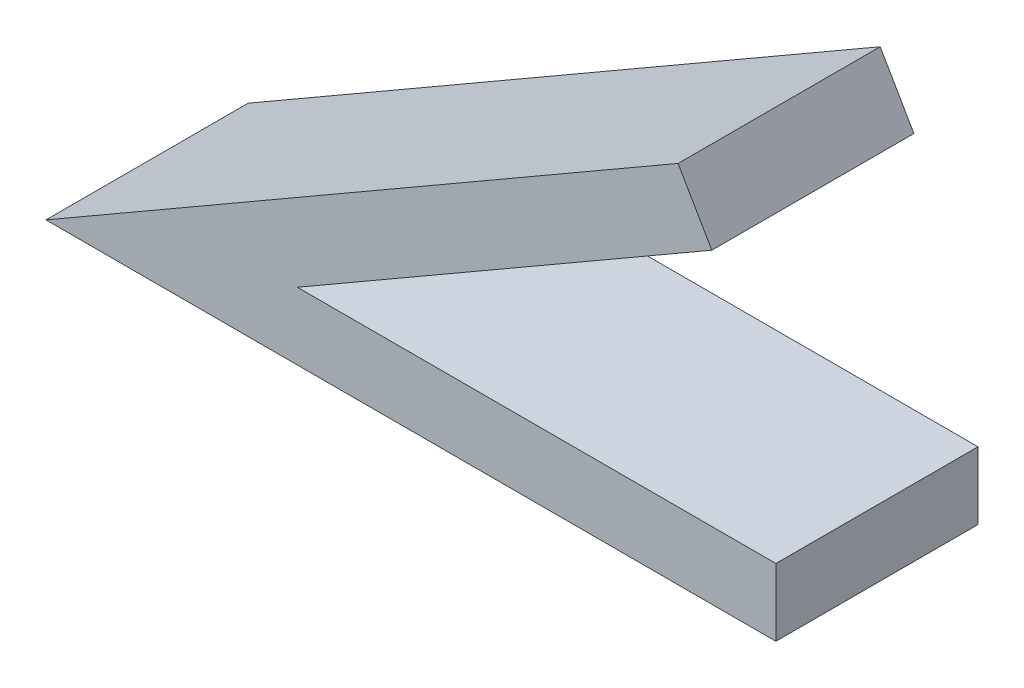
ISO-10303-21;
HEADER;
FILE_DESCRIPTION(('STEP AP214'),'2;1');
FILE_NAME('part.step','',(''),(''),'','','');
FILE_SCHEMA(('AUTOMOTIVE_DESIGN { 1 0 10303 214 1 1 1 1 }'));
ENDSEC;
DATA;
#1=APPLICATION_CONTEXT('core data for automotive mechanical design processes');
#2=APPLICATION_PROTOCOL_DEFINITION('international standard','automotive_design',2000,#1);
#3=PRODUCT_CONTEXT('',#1,'mechanical');
#4=PRODUCT('Part','Part','',(#3));
#5=PRODUCT_RELATED_PRODUCT_CATEGORY('part','',(#4));
#6=PRODUCT_DEFINITION_FORMATION('','',#4);
#7=PRODUCT_DEFINITION_CONTEXT('part definition',#1,'design');
#8=PRODUCT_DEFINITION('design','',#6,#7);
#9=PRODUCT_DEFINITION_SHAPE('','',#8);
#10=(LENGTH_UNIT() NAMED_UNIT(*) SI_UNIT(.MILLI.,.METRE.));
#11=(NAMED_UNIT(*) PLANE_ANGLE_UNIT() SI_UNIT($,.RADIAN.));
#12=(NAMED_UNIT(*) SI_UNIT($,.STERADIAN.) SOLID_ANGLE_UNIT());
#13=UNCERTAINTY_MEASURE_WITH_UNIT(LENGTH_MEASURE(1.E-05),#10,'distance_accuracy_value','');
#14=(GEOMETRIC_REPRESENTATION_CONTEXT(3) GLOBAL_UNCERTAINTY_ASSIGNED_CONTEXT((#13)) GLOBAL_UNIT_ASSIGNED_CONTEXT((#10,
#11,#12)) REPRESENTATION_CONTEXT('',''));
#15=CARTESIAN_POINT('',(0.,0.,0.));
#16=DIRECTION('',(0.,0.,1.));
#17=DIRECTION('',(1.,0.,0.));
#18=AXIS2_PLACEMENT_3D('',#15,#16,#17);
#19=CARTESIAN_POINT('',(0.,0.,18.));
#20=DIRECTION('',(-1.,0.,0.));
#21=DIRECTION('',(0.,0.,1.));
#22=AXIS2_PLACEMENT_3D('',#19,#20,#21);
#23=PLANE('',#22);
#24=DIRECTION('',(0.,1.,0.));
#25=VECTOR('',#24,1.);
#26=CARTESIAN_POINT('',(0.,0.,0.));
#27=LINE('',#26,#25);
#28=CARTESIAN_POINT('',(0.,0.,0.));
#29=VERTEX_POINT('',#28);
#30=CARTESIAN_POINT('',(0.,6.,0.));
#31=VERTEX_POINT('',#30);
#32=EDGE_CURVE('E123',#29,#31,#27,.T.);
#33=ORIENTED_EDGE('',*,*,#32,.T.);
#34=DIRECTION('',(0.,0.,-1.));
#35=VECTOR('',#34,1.);
#36=CARTESIAN_POINT('',(0.,6.,18.));
#37=LINE('',#36,#35);
#38=CARTESIAN_POINT('',(0.,6.,18.));
#39=VERTEX_POINT('',#38);
#40=EDGE_CURVE('E11',#39,#31,#37,.T.);
#41=ORIENTED_EDGE('',*,*,#40,.F.);
#42=DIRECTION('',(0.,1.,0.));
#43=VECTOR('',#42,1.);
#44=CARTESIAN_POINT('',(0.,0.,18.));
#45=LINE('',#44,#43);
#46=CARTESIAN_POINT('',(0.,0.,18.));
#47=VERTEX_POINT('',#46);
#48=EDGE_CURVE('E133',#47,#39,#45,.T.);
#49=ORIENTED_EDGE('',*,*,#48,.F.);
#50=DIRECTION('',(0.,0.,-1.));
#51=VECTOR('',#50,1.);
#52=CARTESIAN_POINT('',(0.,0.,18.));
#53=LINE('',#52,#51);
#54=EDGE_CURVE('E119',#47,#29,#53,.T.);
#55=ORIENTED_EDGE('',*,*,#54,.T.);
#56=EDGE_LOOP('',(#33,#41,#49,#55));
#57=FACE_BOUND('',#56,.T.);
#58=ADVANCED_FACE('F39',(#57),#23,.F.);
#59=CARTESIAN_POINT('',(0.,6.,18.));
#60=DIRECTION('',(0.,-1.,0.));
#61=DIRECTION('',(1.,0.,0.));
#62=AXIS2_PLACEMENT_3D('',#59,#60,#61);
#63=PLANE('',#62);
#64=DIRECTION('',(-1.,0.,0.));
#65=VECTOR('',#64,1.);
#66=CARTESIAN_POINT('',(0.,6.,0.));
#67=LINE('',#66,#65);
#68=CARTESIAN_POINT('',(-42.6076951545865,5.99999999999999,0.));
#69=VERTEX_POINT('',#68);
#70=EDGE_CURVE('E126',#31,#69,#67,.T.);
#71=ORIENTED_EDGE('',*,*,#70,.T.);
#72=DIRECTION('',(0.,0.,-1.));
#73=VECTOR('',#72,1.);
#74=CARTESIAN_POINT('',(-42.6076951545865,5.99999999999999,18.));
#75=LINE('',#74,#73);
#76=CARTESIAN_POINT('',(-42.6076951545865,5.99999999999999,18.));
#77=VERTEX_POINT('',#76);
#78=EDGE_CURVE('E47',#77,#69,#75,.T.);
#79=ORIENTED_EDGE('',*,*,#78,.F.);
#80=DIRECTION('',(-1.,0.,0.));
#81=VECTOR('',#80,1.);
#82=CARTESIAN_POINT('',(0.,6.,18.));
#83=LINE('',#82,#81);
#84=EDGE_CURVE('E92',#39,#77,#83,.T.);
#85=ORIENTED_EDGE('',*,*,#84,.F.);
#86=ORIENTED_EDGE('',*,*,#40,.T.);
#87=EDGE_LOOP('',(#71,#79,#85,#86));
#88=FACE_BOUND('',#87,.T.);
#89=ADVANCED_FACE('F157',(#88),#63,.F.);
#90=CARTESIAN_POINT('',(-42.6076951545865,5.99999999999999,18.));
#91=DIRECTION('',(-0.499999999999995,0.866025403784441,0.));
#92=DIRECTION('',(-0.866025403784442,-0.499999999999995,0.));
#93=AXIS2_PLACEMENT_3D('',#90,#91,#92);
#94=PLANE('',#93);
#95=DIRECTION('',(0.866025403784441,0.499999999999995,0.));
#96=VECTOR('',#95,1.);
#97=CARTESIAN_POINT('',(-42.6076951545865,5.99999999999999,0.));
#98=LINE('',#97,#96);
#99=CARTESIAN_POINT('',(-5.70834875401133,27.303847577293,0.));
#100=VERTEX_POINT('',#99);
#101=EDGE_CURVE('E128',#69,#100,#98,.T.);
#102=ORIENTED_EDGE('',*,*,#101,.T.);
#103=DIRECTION('',(0.,0.,-1.));
#104=VECTOR('',#103,1.);
#105=CARTESIAN_POINT('',(-5.70834875401133,27.303847577293,18.));
#106=LINE('',#105,#104);
#107=CARTESIAN_POINT('',(-5.70834875401133,27.303847577293,18.));
#108=VERTEX_POINT('',#107);
#109=EDGE_CURVE('E114',#108,#100,#106,.T.);
#110=ORIENTED_EDGE('',*,*,#109,.F.);
#111=DIRECTION('',(0.866025403784441,0.499999999999995,0.));
#112=VECTOR('',#111,1.);
#113=CARTESIAN_POINT('',(-42.6076951545865,5.99999999999999,18.));
#114=LINE('',#113,#112);
#115=EDGE_CURVE('E105',#77,#108,#114,.T.);
#116=ORIENTED_EDGE('',*,*,#115,.F.);
#117=ORIENTED_EDGE('',*,*,#78,.T.);
#118=EDGE_LOOP('',(#102,#110,#116,#117));
#119=FACE_BOUND('',#118,.T.);
#120=ADVANCED_FACE('F139',(#119),#94,.F.);
#121=CARTESIAN_POINT('',(-8.7083487540113,32.4999999999997,18.));
#122=DIRECTION('',(-0.866025403784441,-0.499999999999995,0.));
#123=DIRECTION('',(0.499999999999995,-0.866025403784442,0.));
#124=AXIS2_PLACEMENT_3D('',#121,#122,#123);
#125=PLANE('',#124);
#126=DIRECTION('',(-0.499999999999995,0.866025403784441,0.));
#127=VECTOR('',#126,1.);
#128=CARTESIAN_POINT('',(-8.7083487540113,32.4999999999997,0.));
#129=LINE('',#128,#127);
#130=CARTESIAN_POINT('',(-8.7083487540113,32.4999999999997,0.));
#131=VERTEX_POINT('',#130);
#132=EDGE_CURVE('E113',#100,#131,#129,.T.);
#133=ORIENTED_EDGE('',*,*,#132,.T.);
#134=DIRECTION('',(0.,0.,-1.));
#135=VECTOR('',#134,1.);
#136=CARTESIAN_POINT('',(-8.7083487540113,32.4999999999997,18.));
#137=LINE('',#136,#135);
#138=CARTESIAN_POINT('',(-8.7083487540113,32.4999999999997,18.));
#139=VERTEX_POINT('',#138);
#140=EDGE_CURVE('E110',#139,#131,#137,.T.);
#141=ORIENTED_EDGE('',*,*,#140,.F.);
#142=DIRECTION('',(-0.499999999999995,0.866025403784441,0.));
#143=VECTOR('',#142,1.);
#144=CARTESIAN_POINT('',(-8.7083487540113,32.4999999999997,18.));
#145=LINE('',#144,#143);
#146=EDGE_CURVE('E99',#108,#139,#145,.T.);
#147=ORIENTED_EDGE('',*,*,#146,.F.);
#148=ORIENTED_EDGE('',*,*,#109,.T.);
#149=EDGE_LOOP('',(#133,#141,#147,#148));
#150=FACE_BOUND('',#149,.T.);
#151=ADVANCED_FACE('F111',(#150),#125,.F.);
#152=CARTESIAN_POINT('',(-65.,0.,18.));
#153=DIRECTION('',(0.499999999999995,-0.866025403784442,0.));
#154=DIRECTION('',(0.866025403784442,0.499999999999995,0.));
#155=AXIS2_PLACEMENT_3D('',#152,#153,#154);
#156=PLANE('',#155);
#157=DIRECTION('',(-0.866025403784441,-0.499999999999995,0.));
#158=VECTOR('',#157,1.);
#159=CARTESIAN_POINT('',(-65.,0.,0.));
#160=LINE('',#159,#158);
#161=CARTESIAN_POINT('',(-65.,0.,0.));
#162=VERTEX_POINT('',#161);
#163=EDGE_CURVE('E78',#131,#162,#160,.T.);
#164=ORIENTED_EDGE('',*,*,#163,.T.);
#165=DIRECTION('',(0.,0.,-1.));
#166=VECTOR('',#165,1.);
#167=CARTESIAN_POINT('',(-65.,0.,18.));
#168=LINE('',#167,#166);
#169=CARTESIAN_POINT('',(-65.,0.,18.));
#170=VERTEX_POINT('',#169);
#171=EDGE_CURVE('E115',#170,#162,#168,.T.);
#172=ORIENTED_EDGE('',*,*,#171,.F.);
#173=DIRECTION('',(-0.866025403784441,-0.499999999999995,0.));
#174=VECTOR('',#173,1.);
#175=CARTESIAN_POINT('',(-65.,0.,18.));
#176=LINE('',#175,#174);
#177=EDGE_CURVE('E103',#139,#170,#176,.T.);
#178=ORIENTED_EDGE('',*,*,#177,.F.);
#179=ORIENTED_EDGE('',*,*,#140,.T.);
#180=EDGE_LOOP('',(#164,#172,#178,#179));
#181=FACE_BOUND('',#180,.T.);
#182=ADVANCED_FACE('F117',(#181),#156,.F.);
#183=CARTESIAN_POINT('',(0.,0.,18.));
#184=DIRECTION('',(0.,1.,0.));
#185=DIRECTION('',(0.,0.,1.));
#186=AXIS2_PLACEMENT_3D('',#183,#184,#185);
#187=PLANE('',#186);
#188=DIRECTION('',(1.,0.,0.));
#189=VECTOR('',#188,1.);
#190=CARTESIAN_POINT('',(0.,0.,0.));
#191=LINE('',#190,#189);
#192=EDGE_CURVE('E84',#162,#29,#191,.T.);
#193=ORIENTED_EDGE('',*,*,#192,.T.);
#194=ORIENTED_EDGE('',*,*,#54,.F.);
#195=DIRECTION('',(1.,0.,0.));
#196=VECTOR('',#195,1.);
#197=CARTESIAN_POINT('',(0.,0.,18.));
#198=LINE('',#197,#196);
#199=EDGE_CURVE('E55',#170,#47,#198,.T.);
#200=ORIENTED_EDGE('',*,*,#199,.F.);
#201=ORIENTED_EDGE('',*,*,#171,.T.);
#202=EDGE_LOOP('',(#193,#194,#200,#201));
#203=FACE_BOUND('',#202,.T.);
#204=ADVANCED_FACE('F146',(#203),#187,.F.);
#205=CARTESIAN_POINT('',(0.,0.,18.));
#206=DIRECTION('',(0.,0.,1.));
#207=DIRECTION('',(1.,0.,0.));
#208=AXIS2_PLACEMENT_3D('',#205,#206,#207);
#209=PLANE('',#208);
#210=ORIENTED_EDGE('',*,*,#48,.T.);
#211=ORIENTED_EDGE('',*,*,#84,.T.);
#212=ORIENTED_EDGE('',*,*,#115,.T.);
#213=ORIENTED_EDGE('',*,*,#146,.T.);
#214=ORIENTED_EDGE('',*,*,#177,.T.);
#215=ORIENTED_EDGE('',*,*,#199,.T.);
#216=EDGE_LOOP('',(#210,#211,#212,#213,#214,#215));
#217=FACE_BOUND('',#216,.T.);
#218=ADVANCED_FACE('F101',(#217),#209,.T.);
#219=CARTESIAN_POINT('',(0.,0.,0.));
#220=DIRECTION('',(0.,0.,1.));
#221=DIRECTION('',(1.,0.,0.));
#222=AXIS2_PLACEMENT_3D('',#219,#220,#221);
#223=PLANE('',#222);
#224=ORIENTED_EDGE('',*,*,#32,.F.);
#225=ORIENTED_EDGE('',*,*,#192,.F.);
#226=ORIENTED_EDGE('',*,*,#163,.F.);
#227=ORIENTED_EDGE('',*,*,#132,.F.);
#228=ORIENTED_EDGE('',*,*,#101,.F.);
#229=ORIENTED_EDGE('',*,*,#70,.F.);
#230=EDGE_LOOP('',(#224,#225,#226,#227,#228,#229));
#231=FACE_BOUND('',#230,.T.);
#232=ADVANCED_FACE('F142',(#231),#223,.F.);
#233=CLOSED_SHELL('',(#58,#89,#120,#151,#182,#204,#218,#232));
#234=MANIFOLD_SOLID_BREP('B2',#233);
#235=ADVANCED_BREP_SHAPE_REPRESENTATION('',(#18,#234),#14);
#236=SHAPE_DEFINITION_REPRESENTATION(#9,#235);
ENDSEC;
END-ISO-10303-21;
